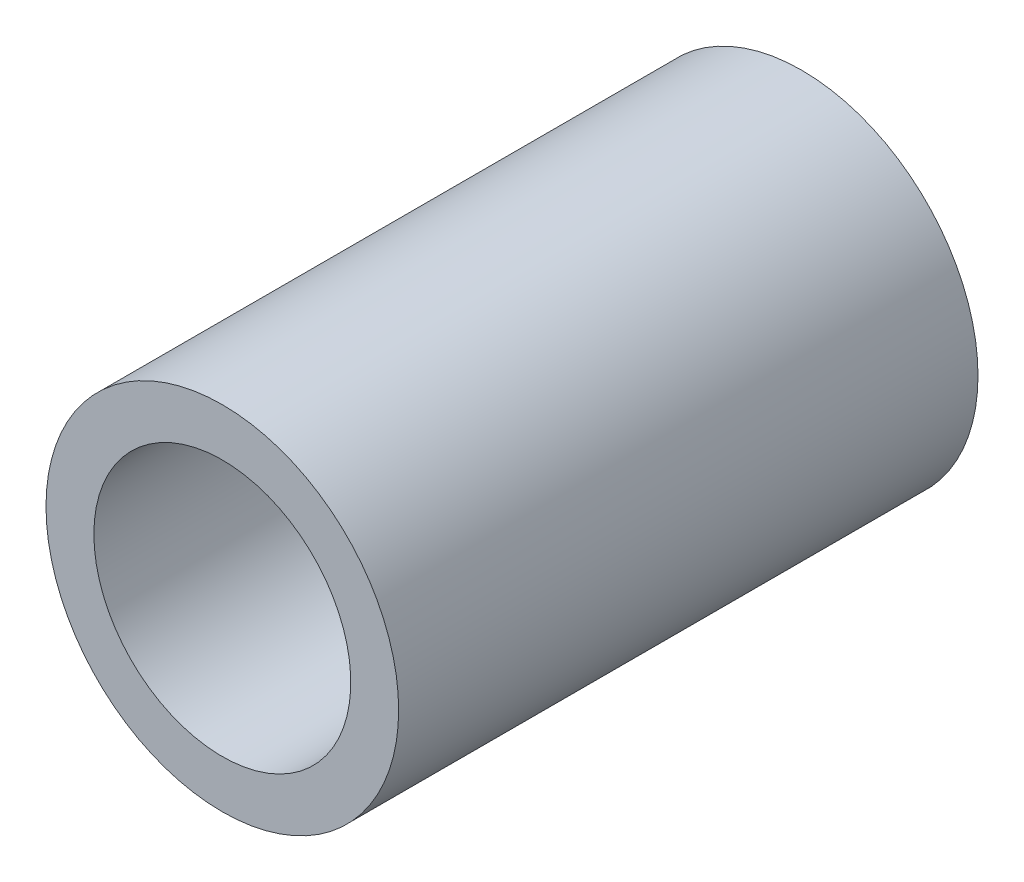
ISO-10303-21;
HEADER;
FILE_DESCRIPTION(('STEP AP214'),'2;1');
FILE_NAME('part.step','',(''),(''),'','','');
FILE_SCHEMA(('AUTOMOTIVE_DESIGN { 1 0 10303 214 1 1 1 1 }'));
ENDSEC;
DATA;
#1=APPLICATION_CONTEXT('core data for automotive mechanical design processes');
#2=APPLICATION_PROTOCOL_DEFINITION('international standard','automotive_design',2000,#1);
#3=PRODUCT_CONTEXT('',#1,'mechanical');
#4=PRODUCT('Part','Part','',(#3));
#5=PRODUCT_RELATED_PRODUCT_CATEGORY('part','',(#4));
#6=PRODUCT_DEFINITION_FORMATION('','',#4);
#7=PRODUCT_DEFINITION_CONTEXT('part definition',#1,'design');
#8=PRODUCT_DEFINITION('design','',#6,#7);
#9=PRODUCT_DEFINITION_SHAPE('','',#8);
#10=(LENGTH_UNIT() NAMED_UNIT(*) SI_UNIT(.MILLI.,.METRE.));
#11=(NAMED_UNIT(*) PLANE_ANGLE_UNIT() SI_UNIT($,.RADIAN.));
#12=(NAMED_UNIT(*) SI_UNIT($,.STERADIAN.) SOLID_ANGLE_UNIT());
#13=UNCERTAINTY_MEASURE_WITH_UNIT(LENGTH_MEASURE(1.E-05),#10,'distance_accuracy_value','');
#14=(GEOMETRIC_REPRESENTATION_CONTEXT(3) GLOBAL_UNCERTAINTY_ASSIGNED_CONTEXT((#13)) GLOBAL_UNIT_ASSIGNED_CONTEXT((#10,
#11,#12)) REPRESENTATION_CONTEXT('',''));
#15=CARTESIAN_POINT('',(0.,0.,0.));
#16=DIRECTION('',(0.,0.,1.));
#17=DIRECTION('',(1.,0.,0.));
#18=AXIS2_PLACEMENT_3D('',#15,#16,#17);
#19=CARTESIAN_POINT('',(0.,0.,23.));
#20=DIRECTION('',(0.,0.,-1.));
#21=DIRECTION('',(-1.,0.,0.));
#22=AXIS2_PLACEMENT_3D('',#19,#20,#21);
#23=CYLINDRICAL_SURFACE('',#22,5.1);
#24=CARTESIAN_POINT('',(0.,0.,0.));
#25=DIRECTION('',(0.,0.,-1.));
#26=DIRECTION('',(-1.,0.,0.));
#27=AXIS2_PLACEMENT_3D('',#24,#25,#26);
#28=CIRCLE('',#27,5.1);
#29=CARTESIAN_POINT('',(-5.1,0.,0.));
#30=VERTEX_POINT('',#29);
#31=EDGE_CURVE('E26',#30,#30,#28,.T.);
#32=ORIENTED_EDGE('',*,*,#31,.T.);
#33=EDGE_LOOP('',(#32));
#34=FACE_BOUND('',#33,.T.);
#35=CARTESIAN_POINT('',(0.,0.,23.));
#36=DIRECTION('',(0.,0.,-1.));
#37=DIRECTION('',(-1.,0.,0.));
#38=AXIS2_PLACEMENT_3D('',#35,#36,#37);
#39=CIRCLE('',#38,5.1);
#40=CARTESIAN_POINT('',(-5.1,0.,23.));
#41=VERTEX_POINT('',#40);
#42=EDGE_CURVE('E17',#41,#41,#39,.T.);
#43=ORIENTED_EDGE('',*,*,#42,.F.);
#44=EDGE_LOOP('',(#43));
#45=FACE_BOUND('',#44,.T.);
#46=ADVANCED_FACE('F14',(#34,#45),#23,.F.);
#47=CARTESIAN_POINT('',(0.,0.,23.));
#48=DIRECTION('',(0.,0.,1.));
#49=DIRECTION('',(1.,0.,0.));
#50=AXIS2_PLACEMENT_3D('',#47,#48,#49);
#51=PLANE('',#50);
#52=ORIENTED_EDGE('',*,*,#42,.T.);
#53=EDGE_LOOP('',(#52));
#54=FACE_BOUND('',#53,.T.);
#55=CARTESIAN_POINT('',(0.,0.,23.));
#56=DIRECTION('',(0.,0.,-1.));
#57=DIRECTION('',(-1.,0.,0.));
#58=AXIS2_PLACEMENT_3D('',#55,#56,#57);
#59=CIRCLE('',#58,7.);
#60=CARTESIAN_POINT('',(-7.,0.,23.));
#61=VERTEX_POINT('',#60);
#62=EDGE_CURVE('E21',#61,#61,#59,.T.);
#63=ORIENTED_EDGE('',*,*,#62,.F.);
#64=EDGE_LOOP('',(#63));
#65=FACE_BOUND('',#64,.T.);
#66=ADVANCED_FACE('F34',(#54,#65),#51,.T.);
#67=CARTESIAN_POINT('',(0.,0.,0.));
#68=DIRECTION('',(0.,0.,1.));
#69=DIRECTION('',(1.,0.,0.));
#70=AXIS2_PLACEMENT_3D('',#67,#68,#69);
#71=PLANE('',#70);
#72=ORIENTED_EDGE('',*,*,#31,.F.);
#73=EDGE_LOOP('',(#72));
#74=FACE_BOUND('',#73,.T.);
#75=CARTESIAN_POINT('',(0.,0.,0.));
#76=DIRECTION('',(0.,0.,-1.));
#77=DIRECTION('',(-1.,0.,0.));
#78=AXIS2_PLACEMENT_3D('',#75,#76,#77);
#79=CIRCLE('',#78,7.);
#80=CARTESIAN_POINT('',(-7.,0.,0.));
#81=VERTEX_POINT('',#80);
#82=EDGE_CURVE('E10',#81,#81,#79,.F.);
#83=ORIENTED_EDGE('',*,*,#82,.F.);
#84=EDGE_LOOP('',(#83));
#85=FACE_BOUND('',#84,.T.);
#86=ADVANCED_FACE('F42',(#74,#85),#71,.F.);
#87=CARTESIAN_POINT('',(0.,0.,23.));
#88=DIRECTION('',(0.,0.,-1.));
#89=DIRECTION('',(-1.,0.,0.));
#90=AXIS2_PLACEMENT_3D('',#87,#88,#89);
#91=CYLINDRICAL_SURFACE('',#90,7.);
#92=ORIENTED_EDGE('',*,*,#82,.T.);
#93=EDGE_LOOP('',(#92));
#94=FACE_BOUND('',#93,.T.);
#95=ORIENTED_EDGE('',*,*,#62,.T.);
#96=EDGE_LOOP('',(#95));
#97=FACE_BOUND('',#96,.T.);
#98=ADVANCED_FACE('F43',(#94,#97),#91,.T.);
#99=CLOSED_SHELL('',(#46,#66,#86,#98));
#100=MANIFOLD_SOLID_BREP('B1',#99);
#101=ADVANCED_BREP_SHAPE_REPRESENTATION('',(#18,#100),#14);
#102=SHAPE_DEFINITION_REPRESENTATION(#9,#101);
ENDSEC;
END-ISO-10303-21;
